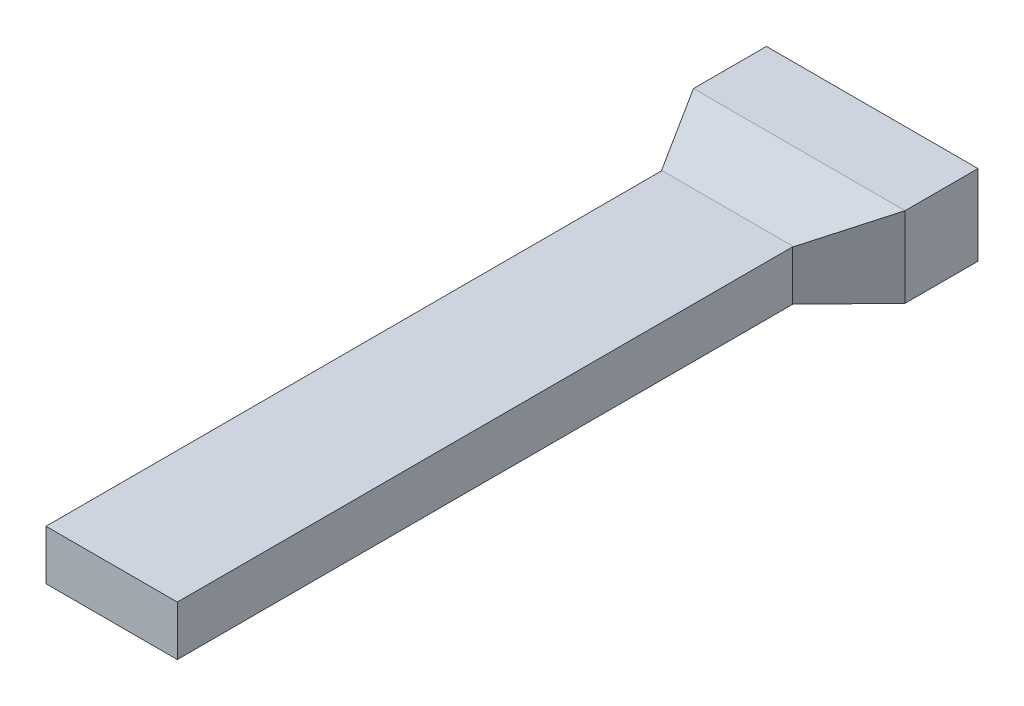
ISO-10303-21;
HEADER;
FILE_DESCRIPTION(('STEP AP214'),'2;1');
FILE_NAME('part.step','',(''),(''),'','','');
FILE_SCHEMA(('AUTOMOTIVE_DESIGN { 1 0 10303 214 1 1 1 1 }'));
ENDSEC;
DATA;
#1=APPLICATION_CONTEXT('core data for automotive mechanical design processes');
#2=APPLICATION_PROTOCOL_DEFINITION('international standard','automotive_design',2000,#1);
#3=PRODUCT_CONTEXT('',#1,'mechanical');
#4=PRODUCT('Part','Part','',(#3));
#5=PRODUCT_RELATED_PRODUCT_CATEGORY('part','',(#4));
#6=PRODUCT_DEFINITION_FORMATION('','',#4);
#7=PRODUCT_DEFINITION_CONTEXT('part definition',#1,'design');
#8=PRODUCT_DEFINITION('design','',#6,#7);
#9=PRODUCT_DEFINITION_SHAPE('','',#8);
#10=(LENGTH_UNIT() NAMED_UNIT(*) SI_UNIT(.MILLI.,.METRE.));
#11=(NAMED_UNIT(*) PLANE_ANGLE_UNIT() SI_UNIT($,.RADIAN.));
#12=(NAMED_UNIT(*) SI_UNIT($,.STERADIAN.) SOLID_ANGLE_UNIT());
#13=UNCERTAINTY_MEASURE_WITH_UNIT(LENGTH_MEASURE(1.E-05),#10,'distance_accuracy_value','');
#14=(GEOMETRIC_REPRESENTATION_CONTEXT(3) GLOBAL_UNCERTAINTY_ASSIGNED_CONTEXT((#13)) GLOBAL_UNIT_ASSIGNED_CONTEXT((#10,
#11,#12)) REPRESENTATION_CONTEXT('',''));
#15=CARTESIAN_POINT('',(0.,0.,0.));
#16=DIRECTION('',(0.,0.,1.));
#17=DIRECTION('',(1.,0.,0.));
#18=AXIS2_PLACEMENT_3D('',#15,#16,#17);
#19=CARTESIAN_POINT('',(0.,0.,20.));
#20=DIRECTION('',(0.,0.,1.));
#21=DIRECTION('',(1.,0.,0.));
#22=AXIS2_PLACEMENT_3D('',#19,#20,#21);
#23=PLANE('',#22);
#24=DIRECTION('',(-1.,0.,0.));
#25=VECTOR('',#24,1.);
#26=CARTESIAN_POINT('',(-22.3084917583317,-3.45728793655963,20.));
#27=LINE('',#26,#25);
#28=CARTESIAN_POINT('',(1.14841772714065,-3.45728793655963,20.));
#29=VERTEX_POINT('',#28);
#30=CARTESIAN_POINT('',(-16.765401243804,-3.45728793655963,20.));
#31=VERTEX_POINT('',#30);
#32=EDGE_CURVE('E105',#29,#31,#27,.T.);
#33=ORIENTED_EDGE('',*,*,#32,.T.);
#34=DIRECTION('',(0.,-1.,0.));
#35=VECTOR('',#34,1.);
#36=CARTESIAN_POINT('',(-16.765401243804,-10.2061567031592,20.));
#37=LINE('',#36,#35);
#38=CARTESIAN_POINT('',(-16.765401243804,-10.2061567031592,20.));
#39=VERTEX_POINT('',#38);
#40=EDGE_CURVE('E91',#31,#39,#37,.T.);
#41=ORIENTED_EDGE('',*,*,#40,.T.);
#42=DIRECTION('',(1.,0.,0.));
#43=VECTOR('',#42,1.);
#44=CARTESIAN_POINT('',(6.69150824166834,-10.2061567031592,20.));
#45=LINE('',#44,#43);
#46=CARTESIAN_POINT('',(1.14841772714065,-10.2061567031592,20.));
#47=VERTEX_POINT('',#46);
#48=EDGE_CURVE('E90',#39,#47,#45,.T.);
#49=ORIENTED_EDGE('',*,*,#48,.T.);
#50=DIRECTION('',(0.,1.,0.));
#51=VECTOR('',#50,1.);
#52=CARTESIAN_POINT('',(1.14841772714065,-3.45728793655963,20.));
#53=LINE('',#52,#51);
#54=EDGE_CURVE('E107',#47,#29,#53,.T.);
#55=ORIENTED_EDGE('',*,*,#54,.T.);
#56=EDGE_LOOP('',(#33,#41,#49,#55));
#57=FACE_BOUND('',#56,.T.);
#58=ADVANCED_FACE('F44',(#57),#23,.T.);
#59=CARTESIAN_POINT('',(0.,0.,10.));
#60=DIRECTION('',(0.,0.,1.));
#61=DIRECTION('',(1.,0.,0.));
#62=AXIS2_PLACEMENT_3D('',#59,#60,#61);
#63=PLANE('',#62);
#64=DIRECTION('',(0.,-1.,0.));
#65=VECTOR('',#64,1.);
#66=CARTESIAN_POINT('',(-22.3084917583317,-1.33172231985941,10.));
#67=LINE('',#66,#65);
#68=CARTESIAN_POINT('',(-22.3084917583317,-1.33172231985941,10.));
#69=VERTEX_POINT('',#68);
#70=CARTESIAN_POINT('',(-22.3084917583317,-12.3317223198594,10.));
#71=VERTEX_POINT('',#70);
#72=EDGE_CURVE('E95',#69,#71,#67,.T.);
#73=ORIENTED_EDGE('',*,*,#72,.F.);
#74=DIRECTION('',(-1.,0.,0.));
#75=VECTOR('',#74,1.);
#76=CARTESIAN_POINT('',(-22.3084917583317,-1.33172231985941,10.));
#77=LINE('',#76,#75);
#78=CARTESIAN_POINT('',(6.69150824166834,-1.33172231985941,10.));
#79=VERTEX_POINT('',#78);
#80=EDGE_CURVE('E102',#79,#69,#77,.T.);
#81=ORIENTED_EDGE('',*,*,#80,.F.);
#82=DIRECTION('',(0.,1.,0.));
#83=VECTOR('',#82,1.);
#84=CARTESIAN_POINT('',(6.69150824166834,-1.33172231985941,10.));
#85=LINE('',#84,#83);
#86=CARTESIAN_POINT('',(6.69150824166834,-12.3317223198594,10.));
#87=VERTEX_POINT('',#86);
#88=EDGE_CURVE('E97',#87,#79,#85,.T.);
#89=ORIENTED_EDGE('',*,*,#88,.F.);
#90=DIRECTION('',(1.,0.,0.));
#91=VECTOR('',#90,1.);
#92=CARTESIAN_POINT('',(-22.3084917583317,-12.3317223198594,10.));
#93=LINE('',#92,#91);
#94=EDGE_CURVE('E88',#71,#87,#93,.T.);
#95=ORIENTED_EDGE('',*,*,#94,.F.);
#96=EDGE_LOOP('',(#73,#81,#89,#95));
#97=FACE_BOUND('',#96,.T.);
#98=ADVANCED_FACE('F93',(#97),#63,.F.);
#99=CARTESIAN_POINT('',(0.,-10.2061567031592,20.));
#100=DIRECTION('',(0.,-0.978147600733806,0.207911690817757));
#101=DIRECTION('',(-1.,0.,0.));
#102=AXIS2_PLACEMENT_3D('',#99,#100,#101);
#103=PLANE('',#102);
#104=ORIENTED_EDGE('',*,*,#48,.F.);
#105=DIRECTION('',(-0.476642931432716,-0.18277454135762,-0.859886610517188));
#106=VECTOR('',#105,1.);
#107=CARTESIAN_POINT('',(-12.9564951501512,-8.74558523879475,26.871448488294));
#108=LINE('',#107,#106);
#109=EDGE_CURVE('E52',#39,#71,#108,.T.);
#110=ORIENTED_EDGE('',*,*,#109,.T.);
#111=ORIENTED_EDGE('',*,*,#94,.T.);
#112=DIRECTION('',(-0.476642931432716,0.18277454135762,0.859886610517188));
#113=VECTOR('',#112,1.);
#114=CARTESIAN_POINT('',(0.887510444615484,-10.1061086257502,20.4706891973735));
#115=LINE('',#114,#113);
#116=EDGE_CURVE('E112',#87,#47,#115,.T.);
#117=ORIENTED_EDGE('',*,*,#116,.T.);
#118=EDGE_LOOP('',(#104,#110,#111,#117));
#119=FACE_BOUND('',#118,.T.);
#120=ADVANCED_FACE('F86',(#119),#103,.T.);
#121=CARTESIAN_POINT('',(0.,-3.45728793655963,20.));
#122=DIRECTION('',(0.,0.978147600733806,0.207911690817756));
#123=DIRECTION('',(1.,0.,0.));
#124=AXIS2_PLACEMENT_3D('',#121,#122,#123);
#125=PLANE('',#124);
#126=ORIENTED_EDGE('',*,*,#80,.T.);
#127=DIRECTION('',(0.476642931432716,-0.18277454135762,0.859886610517188));
#128=VECTOR('',#127,1.);
#129=CARTESIAN_POINT('',(-12.9564951501512,-4.91785940092406,26.871448488294));
#130=LINE('',#129,#128);
#131=EDGE_CURVE('E12',#69,#31,#130,.T.);
#132=ORIENTED_EDGE('',*,*,#131,.T.);
#133=ORIENTED_EDGE('',*,*,#32,.F.);
#134=DIRECTION('',(0.476642931432716,0.18277454135762,-0.859886610517188));
#135=VECTOR('',#134,1.);
#136=CARTESIAN_POINT('',(0.887510444615484,-3.55733601396856,20.4706891973735));
#137=LINE('',#136,#135);
#138=EDGE_CURVE('E110',#29,#79,#137,.T.);
#139=ORIENTED_EDGE('',*,*,#138,.T.);
#140=EDGE_LOOP('',(#126,#132,#133,#139));
#141=FACE_BOUND('',#140,.T.);
#142=ADVANCED_FACE('F116',(#141),#125,.T.);
#143=CARTESIAN_POINT('',(1.14841772714065,0.,20.));
#144=DIRECTION('',(0.874619707139397,0.,0.484809620246335));
#145=DIRECTION('',(0.,-1.,0.));
#146=AXIS2_PLACEMENT_3D('',#143,#144,#145);
#147=PLANE('',#146);
#148=ORIENTED_EDGE('',*,*,#116,.F.);
#149=ORIENTED_EDGE('',*,*,#88,.T.);
#150=ORIENTED_EDGE('',*,*,#138,.F.);
#151=ORIENTED_EDGE('',*,*,#54,.F.);
#152=EDGE_LOOP('',(#148,#149,#150,#151));
#153=FACE_BOUND('',#152,.T.);
#154=ADVANCED_FACE('F118',(#153),#147,.T.);
#155=CARTESIAN_POINT('',(-16.765401243804,0.,20.));
#156=DIRECTION('',(-0.874619707139397,0.,0.484809620246335));
#157=DIRECTION('',(0.,1.,0.));
#158=AXIS2_PLACEMENT_3D('',#155,#156,#157);
#159=PLANE('',#158);
#160=ORIENTED_EDGE('',*,*,#131,.F.);
#161=ORIENTED_EDGE('',*,*,#72,.T.);
#162=ORIENTED_EDGE('',*,*,#109,.F.);
#163=ORIENTED_EDGE('',*,*,#40,.F.);
#164=EDGE_LOOP('',(#160,#161,#162,#163));
#165=FACE_BOUND('',#164,.T.);
#166=ADVANCED_FACE('F46',(#165),#159,.T.);
#167=CLOSED_SHELL('',(#58,#98,#120,#142,#154,#166));
#168=MANIFOLD_SOLID_BREP('B2',#167);
#169=CARTESIAN_POINT('',(0.,0.,10.));
#170=DIRECTION('',(0.,0.,1.));
#171=DIRECTION('',(1.,0.,0.));
#172=AXIS2_PLACEMENT_3D('',#169,#170,#171);
#173=PLANE('',#172);
#174=DIRECTION('',(0.,-1.,0.));
#175=VECTOR('',#174,1.);
#176=CARTESIAN_POINT('',(-22.3084917583317,-1.33172231985941,10.));
#177=LINE('',#176,#175);
#178=CARTESIAN_POINT('',(-22.3084917583317,-1.33172231985941,10.));
#179=VERTEX_POINT('',#178);
#180=CARTESIAN_POINT('',(-22.3084917583317,-12.3317223198594,10.));
#181=VERTEX_POINT('',#180);
#182=EDGE_CURVE('E263',#179,#181,#177,.T.);
#183=ORIENTED_EDGE('',*,*,#182,.T.);
#184=DIRECTION('',(1.,0.,0.));
#185=VECTOR('',#184,1.);
#186=CARTESIAN_POINT('',(-22.3084917583317,-12.3317223198594,10.));
#187=LINE('',#186,#185);
#188=CARTESIAN_POINT('',(6.69150824166834,-12.3317223198594,10.));
#189=VERTEX_POINT('',#188);
#190=EDGE_CURVE('E266',#181,#189,#187,.T.);
#191=ORIENTED_EDGE('',*,*,#190,.T.);
#192=DIRECTION('',(0.,1.,0.));
#193=VECTOR('',#192,1.);
#194=CARTESIAN_POINT('',(6.69150824166834,-1.33172231985941,10.));
#195=LINE('',#194,#193);
#196=CARTESIAN_POINT('',(6.69150824166834,-1.33172231985941,10.));
#197=VERTEX_POINT('',#196);
#198=EDGE_CURVE('E269',#189,#197,#195,.T.);
#199=ORIENTED_EDGE('',*,*,#198,.T.);
#200=DIRECTION('',(-1.,0.,0.));
#201=VECTOR('',#200,1.);
#202=CARTESIAN_POINT('',(-22.3084917583317,-1.33172231985941,10.));
#203=LINE('',#202,#201);
#204=EDGE_CURVE('E271',#197,#179,#203,.T.);
#205=ORIENTED_EDGE('',*,*,#204,.T.);
#206=EDGE_LOOP('',(#183,#191,#199,#205));
#207=FACE_BOUND('',#206,.T.);
#208=DIRECTION('',(-1.,0.,0.));
#209=VECTOR('',#208,1.);
#210=CARTESIAN_POINT('',(1.19150824166834,-3.41792921641113,10.));
#211=LINE('',#210,#209);
#212=CARTESIAN_POINT('',(1.19150824166834,-3.41792921641113,10.));
#213=VERTEX_POINT('',#212);
#214=CARTESIAN_POINT('',(-16.8084917583317,-3.41792921641113,10.));
#215=VERTEX_POINT('',#214);
#216=EDGE_CURVE('E182',#213,#215,#211,.T.);
#217=ORIENTED_EDGE('',*,*,#216,.F.);
#218=DIRECTION('',(0.,1.,0.));
#219=VECTOR('',#218,1.);
#220=CARTESIAN_POINT('',(1.19150824166834,-10.2455154233077,10.));
#221=LINE('',#220,#219);
#222=CARTESIAN_POINT('',(1.19150824166834,-10.2455154233077,10.));
#223=VERTEX_POINT('',#222);
#224=EDGE_CURVE('E253',#223,#213,#221,.T.);
#225=ORIENTED_EDGE('',*,*,#224,.F.);
#226=DIRECTION('',(-1.,0.,0.));
#227=VECTOR('',#226,1.);
#228=CARTESIAN_POINT('',(1.19150824166834,-10.2455154233077,10.));
#229=LINE('',#228,#227);
#230=CARTESIAN_POINT('',(-16.8084917583317,-10.2455154233077,10.));
#231=VERTEX_POINT('',#230);
#232=EDGE_CURVE('E250',#223,#231,#229,.T.);
#233=ORIENTED_EDGE('',*,*,#232,.T.);
#234=DIRECTION('',(0.,1.,0.));
#235=VECTOR('',#234,1.);
#236=CARTESIAN_POINT('',(-16.8084917583317,-10.2455154233077,10.));
#237=LINE('',#236,#235);
#238=EDGE_CURVE('E187',#231,#215,#237,.T.);
#239=ORIENTED_EDGE('',*,*,#238,.T.);
#240=EDGE_LOOP('',(#217,#225,#233,#239));
#241=FACE_BOUND('',#240,.T.);
#242=ADVANCED_FACE('F167',(#207,#241),#173,.T.);
#243=CARTESIAN_POINT('',(-22.3084917583317,-1.33172231985941,10.));
#244=DIRECTION('',(1.,0.,0.));
#245=DIRECTION('',(0.,0.,-1.));
#246=AXIS2_PLACEMENT_3D('',#243,#244,#245);
#247=PLANE('',#246);
#248=DIRECTION('',(0.,-1.,0.));
#249=VECTOR('',#248,1.);
#250=CARTESIAN_POINT('',(-22.3084917583317,-1.33172231985941,0.));
#251=LINE('',#250,#249);
#252=CARTESIAN_POINT('',(-22.3084917583317,-1.33172231985941,0.));
#253=VERTEX_POINT('',#252);
#254=CARTESIAN_POINT('',(-22.3084917583317,-12.3317223198594,0.));
#255=VERTEX_POINT('',#254);
#256=EDGE_CURVE('E254',#253,#255,#251,.T.);
#257=ORIENTED_EDGE('',*,*,#256,.T.);
#258=DIRECTION('',(0.,0.,-1.));
#259=VECTOR('',#258,1.);
#260=CARTESIAN_POINT('',(-22.3084917583317,-12.3317223198594,10.));
#261=LINE('',#260,#259);
#262=EDGE_CURVE('E42',#181,#255,#261,.T.);
#263=ORIENTED_EDGE('',*,*,#262,.F.);
#264=ORIENTED_EDGE('',*,*,#182,.F.);
#265=DIRECTION('',(0.,0.,-1.));
#266=VECTOR('',#265,1.);
#267=CARTESIAN_POINT('',(-22.3084917583317,-1.33172231985941,10.));
#268=LINE('',#267,#266);
#269=EDGE_CURVE('E272',#179,#253,#268,.T.);
#270=ORIENTED_EDGE('',*,*,#269,.T.);
#271=EDGE_LOOP('',(#257,#263,#264,#270));
#272=FACE_BOUND('',#271,.T.);
#273=ADVANCED_FACE('F169',(#272),#247,.F.);
#274=CARTESIAN_POINT('',(-22.3084917583317,-12.3317223198594,10.));
#275=DIRECTION('',(0.,1.,0.));
#276=DIRECTION('',(0.,0.,1.));
#277=AXIS2_PLACEMENT_3D('',#274,#275,#276);
#278=PLANE('',#277);
#279=DIRECTION('',(1.,0.,0.));
#280=VECTOR('',#279,1.);
#281=CARTESIAN_POINT('',(-22.3084917583317,-12.3317223198594,0.));
#282=LINE('',#281,#280);
#283=CARTESIAN_POINT('',(6.69150824166834,-12.3317223198594,0.));
#284=VERTEX_POINT('',#283);
#285=EDGE_CURVE('E257',#255,#284,#282,.T.);
#286=ORIENTED_EDGE('',*,*,#285,.T.);
#287=DIRECTION('',(0.,0.,-1.));
#288=VECTOR('',#287,1.);
#289=CARTESIAN_POINT('',(6.69150824166834,-12.3317223198594,10.));
#290=LINE('',#289,#288);
#291=EDGE_CURVE('E175',#189,#284,#290,.T.);
#292=ORIENTED_EDGE('',*,*,#291,.F.);
#293=ORIENTED_EDGE('',*,*,#190,.F.);
#294=ORIENTED_EDGE('',*,*,#262,.T.);
#295=EDGE_LOOP('',(#286,#292,#293,#294));
#296=FACE_BOUND('',#295,.T.);
#297=ADVANCED_FACE('F302',(#296),#278,.F.);
#298=CARTESIAN_POINT('',(6.69150824166834,-1.33172231985941,10.));
#299=DIRECTION('',(-1.,0.,0.));
#300=DIRECTION('',(0.,-1.,0.));
#301=AXIS2_PLACEMENT_3D('',#298,#299,#300);
#302=PLANE('',#301);
#303=DIRECTION('',(0.,1.,0.));
#304=VECTOR('',#303,1.);
#305=CARTESIAN_POINT('',(6.69150824166834,-1.33172231985941,0.));
#306=LINE('',#305,#304);
#307=CARTESIAN_POINT('',(6.69150824166834,-1.33172231985941,0.));
#308=VERTEX_POINT('',#307);
#309=EDGE_CURVE('E275',#284,#308,#306,.T.);
#310=ORIENTED_EDGE('',*,*,#309,.T.);
#311=DIRECTION('',(0.,0.,-1.));
#312=VECTOR('',#311,1.);
#313=CARTESIAN_POINT('',(6.69150824166834,-1.33172231985941,10.));
#314=LINE('',#313,#312);
#315=EDGE_CURVE('E280',#197,#308,#314,.T.);
#316=ORIENTED_EDGE('',*,*,#315,.F.);
#317=ORIENTED_EDGE('',*,*,#198,.F.);
#318=ORIENTED_EDGE('',*,*,#291,.T.);
#319=EDGE_LOOP('',(#310,#316,#317,#318));
#320=FACE_BOUND('',#319,.T.);
#321=ADVANCED_FACE('F287',(#320),#302,.F.);
#322=CARTESIAN_POINT('',(-22.3084917583317,-1.33172231985941,10.));
#323=DIRECTION('',(0.,-1.,0.));
#324=DIRECTION('',(0.,0.,-1.));
#325=AXIS2_PLACEMENT_3D('',#322,#323,#324);
#326=PLANE('',#325);
#327=DIRECTION('',(-1.,0.,0.));
#328=VECTOR('',#327,1.);
#329=CARTESIAN_POINT('',(-22.3084917583317,-1.33172231985941,0.));
#330=LINE('',#329,#328);
#331=EDGE_CURVE('E267',#308,#253,#330,.T.);
#332=ORIENTED_EDGE('',*,*,#331,.T.);
#333=ORIENTED_EDGE('',*,*,#269,.F.);
#334=ORIENTED_EDGE('',*,*,#204,.F.);
#335=ORIENTED_EDGE('',*,*,#315,.T.);
#336=EDGE_LOOP('',(#332,#333,#334,#335));
#337=FACE_BOUND('',#336,.T.);
#338=ADVANCED_FACE('F296',(#337),#326,.F.);
#339=CARTESIAN_POINT('',(0.,0.,0.));
#340=DIRECTION('',(0.,0.,1.));
#341=DIRECTION('',(1.,0.,0.));
#342=AXIS2_PLACEMENT_3D('',#339,#340,#341);
#343=PLANE('',#342);
#344=ORIENTED_EDGE('',*,*,#256,.F.);
#345=ORIENTED_EDGE('',*,*,#331,.F.);
#346=ORIENTED_EDGE('',*,*,#309,.F.);
#347=ORIENTED_EDGE('',*,*,#285,.F.);
#348=EDGE_LOOP('',(#344,#345,#346,#347));
#349=FACE_BOUND('',#348,.T.);
#350=ADVANCED_FACE('F293',(#349),#343,.F.);
#351=CARTESIAN_POINT('',(1.19150824166834,-10.2455154233077,104.25));
#352=DIRECTION('',(-1.,0.,0.));
#353=DIRECTION('',(0.,-1.,0.));
#354=AXIS2_PLACEMENT_3D('',#351,#352,#353);
#355=PLANE('',#354);
#356=ORIENTED_EDGE('',*,*,#224,.T.);
#357=DIRECTION('',(0.,0.,-1.));
#358=VECTOR('',#357,1.);
#359=CARTESIAN_POINT('',(1.19150824166834,-3.41792921641113,104.25));
#360=LINE('',#359,#358);
#361=CARTESIAN_POINT('',(1.19150824166834,-3.41792921641113,104.25));
#362=VERTEX_POINT('',#361);
#363=EDGE_CURVE('E234',#362,#213,#360,.T.);
#364=ORIENTED_EDGE('',*,*,#363,.F.);
#365=DIRECTION('',(0.,1.,0.));
#366=VECTOR('',#365,1.);
#367=CARTESIAN_POINT('',(1.19150824166834,-10.2455154233077,104.25));
#368=LINE('',#367,#366);
#369=CARTESIAN_POINT('',(1.19150824166834,-10.2455154233077,104.25));
#370=VERTEX_POINT('',#369);
#371=EDGE_CURVE('E241',#370,#362,#368,.T.);
#372=ORIENTED_EDGE('',*,*,#371,.F.);
#373=DIRECTION('',(0.,0.,-1.));
#374=VECTOR('',#373,1.);
#375=CARTESIAN_POINT('',(1.19150824166834,-10.2455154233077,104.25));
#376=LINE('',#375,#374);
#377=EDGE_CURVE('E395',#370,#223,#376,.T.);
#378=ORIENTED_EDGE('',*,*,#377,.T.);
#379=EDGE_LOOP('',(#356,#364,#372,#378));
#380=FACE_BOUND('',#379,.T.);
#381=ADVANCED_FACE('F252',(#380),#355,.F.);
#382=CARTESIAN_POINT('',(1.19150824166834,-3.41792921641113,104.25));
#383=DIRECTION('',(0.,-1.,0.));
#384=DIRECTION('',(1.,0.,0.));
#385=AXIS2_PLACEMENT_3D('',#382,#383,#384);
#386=PLANE('',#385);
#387=ORIENTED_EDGE('',*,*,#216,.T.);
#388=DIRECTION('',(0.,0.,-1.));
#389=VECTOR('',#388,1.);
#390=CARTESIAN_POINT('',(-16.8084917583317,-3.41792921641113,104.25));
#391=LINE('',#390,#389);
#392=CARTESIAN_POINT('',(-16.8084917583317,-3.41792921641113,104.25));
#393=VERTEX_POINT('',#392);
#394=EDGE_CURVE('E236',#393,#215,#391,.T.);
#395=ORIENTED_EDGE('',*,*,#394,.F.);
#396=DIRECTION('',(-1.,0.,0.));
#397=VECTOR('',#396,1.);
#398=CARTESIAN_POINT('',(1.19150824166834,-3.41792921641113,104.25));
#399=LINE('',#398,#397);
#400=EDGE_CURVE('E230',#362,#393,#399,.T.);
#401=ORIENTED_EDGE('',*,*,#400,.F.);
#402=ORIENTED_EDGE('',*,*,#363,.T.);
#403=EDGE_LOOP('',(#387,#395,#401,#402));
#404=FACE_BOUND('',#403,.T.);
#405=ADVANCED_FACE('F232',(#404),#386,.F.);
#406=CARTESIAN_POINT('',(-16.8084917583317,-10.2455154233077,104.25));
#407=DIRECTION('',(-1.,0.,0.));
#408=DIRECTION('',(0.,0.,1.));
#409=AXIS2_PLACEMENT_3D('',#406,#407,#408);
#410=PLANE('',#409);
#411=ORIENTED_EDGE('',*,*,#238,.F.);
#412=DIRECTION('',(0.,0.,-1.));
#413=VECTOR('',#412,1.);
#414=CARTESIAN_POINT('',(-16.8084917583317,-10.2455154233077,104.25));
#415=LINE('',#414,#413);
#416=CARTESIAN_POINT('',(-16.8084917583317,-10.2455154233077,104.25));
#417=VERTEX_POINT('',#416);
#418=EDGE_CURVE('E259',#417,#231,#415,.T.);
#419=ORIENTED_EDGE('',*,*,#418,.F.);
#420=DIRECTION('',(0.,1.,0.));
#421=VECTOR('',#420,1.);
#422=CARTESIAN_POINT('',(-16.8084917583317,-10.2455154233077,104.25));
#423=LINE('',#422,#421);
#424=EDGE_CURVE('E240',#417,#393,#423,.T.);
#425=ORIENTED_EDGE('',*,*,#424,.T.);
#426=ORIENTED_EDGE('',*,*,#394,.T.);
#427=EDGE_LOOP('',(#411,#419,#425,#426));
#428=FACE_BOUND('',#427,.T.);
#429=ADVANCED_FACE('F338',(#428),#410,.T.);
#430=CARTESIAN_POINT('',(1.19150824166834,-10.2455154233077,104.25));
#431=DIRECTION('',(0.,-1.,0.));
#432=DIRECTION('',(0.,0.,-1.));
#433=AXIS2_PLACEMENT_3D('',#430,#431,#432);
#434=PLANE('',#433);
#435=ORIENTED_EDGE('',*,*,#232,.F.);
#436=ORIENTED_EDGE('',*,*,#377,.F.);
#437=DIRECTION('',(-1.,0.,0.));
#438=VECTOR('',#437,1.);
#439=CARTESIAN_POINT('',(1.19150824166834,-10.2455154233077,104.25));
#440=LINE('',#439,#438);
#441=EDGE_CURVE('E247',#370,#417,#440,.T.);
#442=ORIENTED_EDGE('',*,*,#441,.T.);
#443=ORIENTED_EDGE('',*,*,#418,.T.);
#444=EDGE_LOOP('',(#435,#436,#442,#443));
#445=FACE_BOUND('',#444,.T.);
#446=ADVANCED_FACE('F344',(#445),#434,.T.);
#447=CARTESIAN_POINT('',(0.,0.,104.25));
#448=DIRECTION('',(0.,0.,1.));
#449=DIRECTION('',(1.,0.,0.));
#450=AXIS2_PLACEMENT_3D('',#447,#448,#449);
#451=PLANE('',#450);
#452=ORIENTED_EDGE('',*,*,#371,.T.);
#453=ORIENTED_EDGE('',*,*,#400,.T.);
#454=ORIENTED_EDGE('',*,*,#424,.F.);
#455=ORIENTED_EDGE('',*,*,#441,.F.);
#456=EDGE_LOOP('',(#452,#453,#454,#455));
#457=FACE_BOUND('',#456,.T.);
#458=ADVANCED_FACE('F245',(#457),#451,.T.);
#459=CLOSED_SHELL('',(#242,#273,#297,#321,#338,#350,#381,#405,#429,#446,#458));
#460=MANIFOLD_SOLID_BREP('B6',#459);
#461=ADVANCED_BREP_SHAPE_REPRESENTATION('',(#18,#168,#460),#14);
#462=SHAPE_DEFINITION_REPRESENTATION(#9,#461);
ENDSEC;
END-ISO-10303-21;
